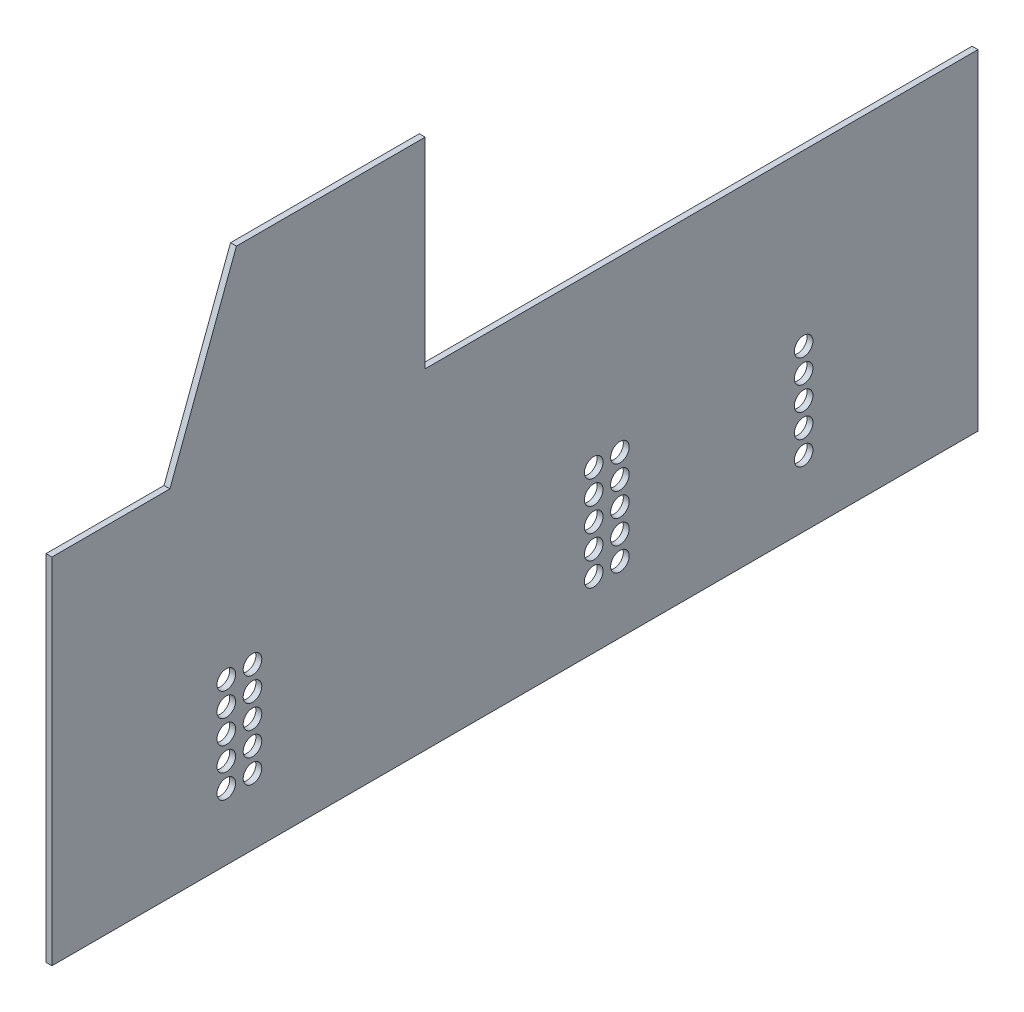
ISO-10303-21;
HEADER;
FILE_DESCRIPTION(('STEP AP214'),'2;1');
FILE_NAME('part.step','',(''),(''),'','','');
FILE_SCHEMA(('AUTOMOTIVE_DESIGN { 1 0 10303 214 1 1 1 1 }'));
ENDSEC;
DATA;
#1=APPLICATION_CONTEXT('core data for automotive mechanical design processes');
#2=APPLICATION_PROTOCOL_DEFINITION('international standard','automotive_design',2000,#1);
#3=PRODUCT_CONTEXT('',#1,'mechanical');
#4=PRODUCT('Part','Part','',(#3));
#5=PRODUCT_RELATED_PRODUCT_CATEGORY('part','',(#4));
#6=PRODUCT_DEFINITION_FORMATION('','',#4);
#7=PRODUCT_DEFINITION_CONTEXT('part definition',#1,'design');
#8=PRODUCT_DEFINITION('design','',#6,#7);
#9=PRODUCT_DEFINITION_SHAPE('','',#8);
#10=(LENGTH_UNIT() NAMED_UNIT(*) SI_UNIT(.MILLI.,.METRE.));
#11=(NAMED_UNIT(*) PLANE_ANGLE_UNIT() SI_UNIT($,.RADIAN.));
#12=(NAMED_UNIT(*) SI_UNIT($,.STERADIAN.) SOLID_ANGLE_UNIT());
#13=UNCERTAINTY_MEASURE_WITH_UNIT(LENGTH_MEASURE(1.E-05),#10,'distance_accuracy_value','');
#14=(GEOMETRIC_REPRESENTATION_CONTEXT(3) GLOBAL_UNCERTAINTY_ASSIGNED_CONTEXT((#13)) GLOBAL_UNIT_ASSIGNED_CONTEXT((#10,
#11,#12)) REPRESENTATION_CONTEXT('',''));
#15=CARTESIAN_POINT('',(0.,0.,0.));
#16=DIRECTION('',(0.,0.,1.));
#17=DIRECTION('',(1.,0.,0.));
#18=AXIS2_PLACEMENT_3D('',#15,#16,#17);
#19=CARTESIAN_POINT('',(1.5875,-40.4748999999981,-155.333699999996));
#20=DIRECTION('',(-1.,0.,0.));
#21=DIRECTION('',(0.,0.,1.));
#22=AXIS2_PLACEMENT_3D('',#19,#20,#21);
#23=CYLINDRICAL_SURFACE('',#22,4.99999999999999);
#24=CARTESIAN_POINT('',(1.5875,-40.4748999999981,-155.333699999996));
#25=DIRECTION('',(-1.,0.,0.));
#26=DIRECTION('',(0.,0.,1.));
#27=AXIS2_PLACEMENT_3D('',#24,#25,#26);
#28=CIRCLE('',#27,4.99999999999999);
#29=CARTESIAN_POINT('',(1.5875,-40.4748999999981,-150.333699999996));
#30=VERTEX_POINT('',#29);
#31=EDGE_CURVE('E42',#30,#30,#28,.T.);
#32=ORIENTED_EDGE('',*,*,#31,.F.);
#33=EDGE_LOOP('',(#32));
#34=FACE_BOUND('',#33,.T.);
#35=CARTESIAN_POINT('',(-1.5875,-40.4748999999981,-155.333699999996));
#36=DIRECTION('',(-1.,0.,0.));
#37=DIRECTION('',(0.,0.,1.));
#38=AXIS2_PLACEMENT_3D('',#35,#36,#37);
#39=CIRCLE('',#38,4.99999999999999);
#40=CARTESIAN_POINT('',(-1.5875,-40.4748999999981,-150.333699999996));
#41=VERTEX_POINT('',#40);
#42=EDGE_CURVE('E11',#41,#41,#39,.T.);
#43=ORIENTED_EDGE('',*,*,#42,.T.);
#44=EDGE_LOOP('',(#43));
#45=FACE_BOUND('',#44,.T.);
#46=ADVANCED_FACE('F35',(#34,#45),#23,.F.);
#47=CARTESIAN_POINT('',(1.5875,-53.1748999999981,-155.333699999996));
#48=DIRECTION('',(-1.,0.,0.));
#49=DIRECTION('',(0.,0.,1.));
#50=AXIS2_PLACEMENT_3D('',#47,#48,#49);
#51=CYLINDRICAL_SURFACE('',#50,4.99999999999999);
#52=CARTESIAN_POINT('',(1.5875,-53.1748999999981,-155.333699999996));
#53=DIRECTION('',(-1.,0.,0.));
#54=DIRECTION('',(0.,0.,1.));
#55=AXIS2_PLACEMENT_3D('',#52,#53,#54);
#56=CIRCLE('',#55,4.99999999999999);
#57=CARTESIAN_POINT('',(1.5875,-53.1748999999981,-150.333699999996));
#58=VERTEX_POINT('',#57);
#59=EDGE_CURVE('E193',#58,#58,#56,.T.);
#60=ORIENTED_EDGE('',*,*,#59,.F.);
#61=EDGE_LOOP('',(#60));
#62=FACE_BOUND('',#61,.T.);
#63=CARTESIAN_POINT('',(-1.5875,-53.1748999999981,-155.333699999996));
#64=DIRECTION('',(-1.,0.,0.));
#65=DIRECTION('',(0.,0.,1.));
#66=AXIS2_PLACEMENT_3D('',#63,#64,#65);
#67=CIRCLE('',#66,4.99999999999999);
#68=CARTESIAN_POINT('',(-1.5875,-53.1748999999981,-150.333699999996));
#69=VERTEX_POINT('',#68);
#70=EDGE_CURVE('E196',#69,#69,#67,.T.);
#71=ORIENTED_EDGE('',*,*,#70,.T.);
#72=EDGE_LOOP('',(#71));
#73=FACE_BOUND('',#72,.T.);
#74=ADVANCED_FACE('F204',(#62,#73),#51,.F.);
#75=CARTESIAN_POINT('',(1.5875,-15.0748999999981,-155.333699999996));
#76=DIRECTION('',(-1.,0.,0.));
#77=DIRECTION('',(0.,0.,1.));
#78=AXIS2_PLACEMENT_3D('',#75,#76,#77);
#79=CYLINDRICAL_SURFACE('',#78,4.99999999999999);
#80=CARTESIAN_POINT('',(1.5875,-15.0748999999981,-155.333699999996));
#81=DIRECTION('',(-1.,0.,0.));
#82=DIRECTION('',(0.,0.,1.));
#83=AXIS2_PLACEMENT_3D('',#80,#81,#82);
#84=CIRCLE('',#83,4.99999999999999);
#85=CARTESIAN_POINT('',(1.5875,-15.0748999999981,-150.333699999996));
#86=VERTEX_POINT('',#85);
#87=EDGE_CURVE('E187',#86,#86,#84,.T.);
#88=ORIENTED_EDGE('',*,*,#87,.F.);
#89=EDGE_LOOP('',(#88));
#90=FACE_BOUND('',#89,.T.);
#91=CARTESIAN_POINT('',(-1.5875,-15.0748999999981,-155.333699999996));
#92=DIRECTION('',(-1.,0.,0.));
#93=DIRECTION('',(0.,0.,1.));
#94=AXIS2_PLACEMENT_3D('',#91,#92,#93);
#95=CIRCLE('',#94,4.99999999999999);
#96=CARTESIAN_POINT('',(-1.5875,-15.0748999999981,-150.333699999996));
#97=VERTEX_POINT('',#96);
#98=EDGE_CURVE('E190',#97,#97,#95,.T.);
#99=ORIENTED_EDGE('',*,*,#98,.T.);
#100=EDGE_LOOP('',(#99));
#101=FACE_BOUND('',#100,.T.);
#102=ADVANCED_FACE('F243',(#90,#101),#79,.F.);
#103=CARTESIAN_POINT('',(1.5875,-27.7748999999981,-155.333699999996));
#104=DIRECTION('',(-1.,0.,0.));
#105=DIRECTION('',(0.,0.,1.));
#106=AXIS2_PLACEMENT_3D('',#103,#104,#105);
#107=CYLINDRICAL_SURFACE('',#106,4.99999999999999);
#108=CARTESIAN_POINT('',(1.5875,-27.7748999999981,-155.333699999996));
#109=DIRECTION('',(-1.,0.,0.));
#110=DIRECTION('',(0.,0.,1.));
#111=AXIS2_PLACEMENT_3D('',#108,#109,#110);
#112=CIRCLE('',#111,4.99999999999999);
#113=CARTESIAN_POINT('',(1.5875,-27.7748999999981,-150.333699999996));
#114=VERTEX_POINT('',#113);
#115=EDGE_CURVE('E181',#114,#114,#112,.T.);
#116=ORIENTED_EDGE('',*,*,#115,.F.);
#117=EDGE_LOOP('',(#116));
#118=FACE_BOUND('',#117,.T.);
#119=CARTESIAN_POINT('',(-1.5875,-27.7748999999981,-155.333699999996));
#120=DIRECTION('',(-1.,0.,0.));
#121=DIRECTION('',(0.,0.,1.));
#122=AXIS2_PLACEMENT_3D('',#119,#120,#121);
#123=CIRCLE('',#122,4.99999999999999);
#124=CARTESIAN_POINT('',(-1.5875,-27.7748999999981,-150.333699999996));
#125=VERTEX_POINT('',#124);
#126=EDGE_CURVE('E184',#125,#125,#123,.T.);
#127=ORIENTED_EDGE('',*,*,#126,.T.);
#128=EDGE_LOOP('',(#127));
#129=FACE_BOUND('',#128,.T.);
#130=ADVANCED_FACE('F239',(#118,#129),#107,.F.);
#131=CARTESIAN_POINT('',(1.5875,-2.37489999999807,-155.333699999996));
#132=DIRECTION('',(-1.,0.,0.));
#133=DIRECTION('',(0.,0.,1.));
#134=AXIS2_PLACEMENT_3D('',#131,#132,#133);
#135=CYLINDRICAL_SURFACE('',#134,4.99999999999999);
#136=CARTESIAN_POINT('',(1.5875,-2.37489999999807,-155.333699999996));
#137=DIRECTION('',(-1.,0.,0.));
#138=DIRECTION('',(0.,0.,1.));
#139=AXIS2_PLACEMENT_3D('',#136,#137,#138);
#140=CIRCLE('',#139,4.99999999999999);
#141=CARTESIAN_POINT('',(1.5875,-2.37489999999807,-150.333699999996));
#142=VERTEX_POINT('',#141);
#143=EDGE_CURVE('E175',#142,#142,#140,.T.);
#144=ORIENTED_EDGE('',*,*,#143,.F.);
#145=EDGE_LOOP('',(#144));
#146=FACE_BOUND('',#145,.T.);
#147=CARTESIAN_POINT('',(-1.5875,-2.37489999999807,-155.333699999996));
#148=DIRECTION('',(-1.,0.,0.));
#149=DIRECTION('',(0.,0.,1.));
#150=AXIS2_PLACEMENT_3D('',#147,#148,#149);
#151=CIRCLE('',#150,4.99999999999999);
#152=CARTESIAN_POINT('',(-1.5875,-2.37489999999807,-150.333699999996));
#153=VERTEX_POINT('',#152);
#154=EDGE_CURVE('E178',#153,#153,#151,.T.);
#155=ORIENTED_EDGE('',*,*,#154,.T.);
#156=EDGE_LOOP('',(#155));
#157=FACE_BOUND('',#156,.T.);
#158=ADVANCED_FACE('F233',(#146,#157),#135,.F.);
#159=CARTESIAN_POINT('',(1.5875,88.9,249.174));
#160=DIRECTION('',(0.,-1.,0.));
#161=DIRECTION('',(0.,0.,-1.));
#162=AXIS2_PLACEMENT_3D('',#159,#160,#161);
#163=PLANE('',#162);
#164=DIRECTION('',(-1.,0.,0.));
#165=VECTOR('',#164,1.);
#166=CARTESIAN_POINT('',(1.5875,88.9,48.2853999999997));
#167=LINE('',#166,#165);
#168=CARTESIAN_POINT('',(1.5875,88.9,48.2853999999997));
#169=VERTEX_POINT('',#168);
#170=CARTESIAN_POINT('',(-1.5875,88.9,48.2853999999997));
#171=VERTEX_POINT('',#170);
#172=EDGE_CURVE('E49',#169,#171,#167,.T.);
#173=ORIENTED_EDGE('',*,*,#172,.F.);
#174=DIRECTION('',(0.,0.,1.));
#175=VECTOR('',#174,1.);
#176=CARTESIAN_POINT('',(1.5875,88.9,249.174));
#177=LINE('',#176,#175);
#178=CARTESIAN_POINT('',(1.5875,88.9,-249.174));
#179=VERTEX_POINT('',#178);
#180=EDGE_CURVE('E78',#179,#169,#177,.T.);
#181=ORIENTED_EDGE('',*,*,#180,.F.);
#182=DIRECTION('',(-1.,0.,0.));
#183=VECTOR('',#182,1.);
#184=CARTESIAN_POINT('',(1.5875,88.9,-249.174));
#185=LINE('',#184,#183);
#186=CARTESIAN_POINT('',(-1.5875,88.9,-249.174));
#187=VERTEX_POINT('',#186);
#188=EDGE_CURVE('E173',#179,#187,#185,.T.);
#189=ORIENTED_EDGE('',*,*,#188,.T.);
#190=DIRECTION('',(0.,0.,1.));
#191=VECTOR('',#190,1.);
#192=CARTESIAN_POINT('',(-1.5875,88.9,249.174));
#193=LINE('',#192,#191);
#194=EDGE_CURVE('E165',#187,#171,#193,.T.);
#195=ORIENTED_EDGE('',*,*,#194,.T.);
#196=EDGE_LOOP('',(#173,#181,#189,#195));
#197=FACE_BOUND('',#196,.T.);
#198=ADVANCED_FACE('F230',(#197),#163,.F.);
#199=CARTESIAN_POINT('',(1.5875,88.9,-249.174));
#200=DIRECTION('',(0.,0.,1.));
#201=DIRECTION('',(0.,-1.,0.));
#202=AXIS2_PLACEMENT_3D('',#199,#200,#201);
#203=PLANE('',#202);
#204=DIRECTION('',(0.,1.,0.));
#205=VECTOR('',#204,1.);
#206=CARTESIAN_POINT('',(-1.5875,88.9,-249.174));
#207=LINE('',#206,#205);
#208=CARTESIAN_POINT('',(-1.5875,-88.9,-249.174));
#209=VERTEX_POINT('',#208);
#210=EDGE_CURVE('E150',#209,#187,#207,.T.);
#211=ORIENTED_EDGE('',*,*,#210,.T.);
#212=ORIENTED_EDGE('',*,*,#188,.F.);
#213=DIRECTION('',(0.,1.,0.));
#214=VECTOR('',#213,1.);
#215=CARTESIAN_POINT('',(1.5875,88.9,-249.174));
#216=LINE('',#215,#214);
#217=CARTESIAN_POINT('',(1.5875,-88.9,-249.174));
#218=VERTEX_POINT('',#217);
#219=EDGE_CURVE('E156',#218,#179,#216,.T.);
#220=ORIENTED_EDGE('',*,*,#219,.F.);
#221=DIRECTION('',(-1.,0.,0.));
#222=VECTOR('',#221,1.);
#223=CARTESIAN_POINT('',(1.5875,-88.9,-249.174));
#224=LINE('',#223,#222);
#225=EDGE_CURVE('E162',#218,#209,#224,.T.);
#226=ORIENTED_EDGE('',*,*,#225,.T.);
#227=EDGE_LOOP('',(#211,#212,#220,#226));
#228=FACE_BOUND('',#227,.T.);
#229=ADVANCED_FACE('F228',(#228),#203,.F.);
#230=CARTESIAN_POINT('',(1.5875,88.9,249.174));
#231=DIRECTION('',(0.,0.,-1.));
#232=DIRECTION('',(-1.,0.,0.));
#233=AXIS2_PLACEMENT_3D('',#230,#231,#232);
#234=PLANE('',#233);
#235=DIRECTION('',(0.,-1.,0.));
#236=VECTOR('',#235,1.);
#237=CARTESIAN_POINT('',(-1.5875,88.9,249.174));
#238=LINE('',#237,#236);
#239=CARTESIAN_POINT('',(-1.5875,101.6,249.174));
#240=VERTEX_POINT('',#239);
#241=CARTESIAN_POINT('',(-1.5875,-88.9,249.174));
#242=VERTEX_POINT('',#241);
#243=EDGE_CURVE('E167',#240,#242,#238,.T.);
#244=ORIENTED_EDGE('',*,*,#243,.T.);
#245=DIRECTION('',(-1.,0.,0.));
#246=VECTOR('',#245,1.);
#247=CARTESIAN_POINT('',(1.5875,-88.9,249.174));
#248=LINE('',#247,#246);
#249=CARTESIAN_POINT('',(1.5875,-88.9,249.174));
#250=VERTEX_POINT('',#249);
#251=EDGE_CURVE('E171',#250,#242,#248,.T.);
#252=ORIENTED_EDGE('',*,*,#251,.F.);
#253=DIRECTION('',(0.,-1.,0.));
#254=VECTOR('',#253,1.);
#255=CARTESIAN_POINT('',(1.5875,88.9,249.174));
#256=LINE('',#255,#254);
#257=CARTESIAN_POINT('',(1.5875,101.6,249.174));
#258=VERTEX_POINT('',#257);
#259=EDGE_CURVE('E159',#258,#250,#256,.T.);
#260=ORIENTED_EDGE('',*,*,#259,.F.);
#261=DIRECTION('',(-1.,0.,0.));
#262=VECTOR('',#261,1.);
#263=CARTESIAN_POINT('',(1.5875,101.6,249.174));
#264=LINE('',#263,#262);
#265=EDGE_CURVE('E151',#258,#240,#264,.T.);
#266=ORIENTED_EDGE('',*,*,#265,.T.);
#267=EDGE_LOOP('',(#244,#252,#260,#266));
#268=FACE_BOUND('',#267,.T.);
#269=ADVANCED_FACE('F225',(#268),#234,.F.);
#270=CARTESIAN_POINT('',(1.5875,-88.9,249.174));
#271=DIRECTION('',(0.,1.,0.));
#272=DIRECTION('',(0.,0.,1.));
#273=AXIS2_PLACEMENT_3D('',#270,#271,#272);
#274=PLANE('',#273);
#275=DIRECTION('',(0.,0.,-1.));
#276=VECTOR('',#275,1.);
#277=CARTESIAN_POINT('',(-1.5875,-88.9,249.174));
#278=LINE('',#277,#276);
#279=EDGE_CURVE('E75',#242,#209,#278,.T.);
#280=ORIENTED_EDGE('',*,*,#279,.T.);
#281=ORIENTED_EDGE('',*,*,#225,.F.);
#282=DIRECTION('',(0.,0.,-1.));
#283=VECTOR('',#282,1.);
#284=CARTESIAN_POINT('',(1.5875,-88.9,249.174));
#285=LINE('',#284,#283);
#286=EDGE_CURVE('E58',#250,#218,#285,.T.);
#287=ORIENTED_EDGE('',*,*,#286,.F.);
#288=ORIENTED_EDGE('',*,*,#251,.T.);
#289=EDGE_LOOP('',(#280,#281,#287,#288));
#290=FACE_BOUND('',#289,.T.);
#291=ADVANCED_FACE('F217',(#290),#274,.F.);
#292=CARTESIAN_POINT('',(1.5875,0.,0.));
#293=DIRECTION('',(1.,0.,0.));
#294=DIRECTION('',(0.,0.,-1.));
#295=AXIS2_PLACEMENT_3D('',#292,#293,#294);
#296=PLANE('',#295);
#297=CARTESIAN_POINT('',(1.5875,-40.4748999999981,-56.4768999999964));
#298=DIRECTION('',(-1.,0.,0.));
#299=DIRECTION('',(0.,0.,1.));
#300=AXIS2_PLACEMENT_3D('',#297,#298,#299);
#301=CIRCLE('',#300,4.99999999999999);
#302=CARTESIAN_POINT('',(1.5875,-40.4748999999981,-51.4768999999965));
#303=VERTEX_POINT('',#302);
#304=EDGE_CURVE('E687',#303,#303,#301,.T.);
#305=ORIENTED_EDGE('',*,*,#304,.T.);
#306=EDGE_LOOP('',(#305));
#307=FACE_BOUND('',#306,.T.);
#308=CARTESIAN_POINT('',(1.5875,-53.1748999999981,-56.4768999999964));
#309=DIRECTION('',(-1.,0.,0.));
#310=DIRECTION('',(0.,0.,1.));
#311=AXIS2_PLACEMENT_3D('',#308,#309,#310);
#312=CIRCLE('',#311,4.99999999999999);
#313=CARTESIAN_POINT('',(1.5875,-53.1748999999981,-51.4768999999965));
#314=VERTEX_POINT('',#313);
#315=EDGE_CURVE('E681',#314,#314,#312,.T.);
#316=ORIENTED_EDGE('',*,*,#315,.T.);
#317=EDGE_LOOP('',(#316));
#318=FACE_BOUND('',#317,.T.);
#319=CARTESIAN_POINT('',(1.5875,-15.0748999999981,-56.4768999999964));
#320=DIRECTION('',(-1.,0.,0.));
#321=DIRECTION('',(0.,0.,1.));
#322=AXIS2_PLACEMENT_3D('',#319,#320,#321);
#323=CIRCLE('',#322,4.99999999999999);
#324=CARTESIAN_POINT('',(1.5875,-15.0748999999981,-51.4768999999965));
#325=VERTEX_POINT('',#324);
#326=EDGE_CURVE('E675',#325,#325,#323,.T.);
#327=ORIENTED_EDGE('',*,*,#326,.T.);
#328=EDGE_LOOP('',(#327));
#329=FACE_BOUND('',#328,.T.);
#330=CARTESIAN_POINT('',(1.5875,-27.7748999999981,-56.4768999999964));
#331=DIRECTION('',(-1.,0.,0.));
#332=DIRECTION('',(0.,0.,1.));
#333=AXIS2_PLACEMENT_3D('',#330,#331,#332);
#334=CIRCLE('',#333,4.99999999999999);
#335=CARTESIAN_POINT('',(1.5875,-27.7748999999981,-51.4768999999965));
#336=VERTEX_POINT('',#335);
#337=EDGE_CURVE('E669',#336,#336,#334,.T.);
#338=ORIENTED_EDGE('',*,*,#337,.T.);
#339=EDGE_LOOP('',(#338));
#340=FACE_BOUND('',#339,.T.);
#341=CARTESIAN_POINT('',(1.5875,-2.37489999999807,-56.4768999999964));
#342=DIRECTION('',(-1.,0.,0.));
#343=DIRECTION('',(0.,0.,1.));
#344=AXIS2_PLACEMENT_3D('',#341,#342,#343);
#345=CIRCLE('',#344,4.99999999999999);
#346=CARTESIAN_POINT('',(1.5875,-2.37489999999807,-51.4768999999965));
#347=VERTEX_POINT('',#346);
#348=EDGE_CURVE('E663',#347,#347,#345,.T.);
#349=ORIENTED_EDGE('',*,*,#348,.T.);
#350=EDGE_LOOP('',(#349));
#351=FACE_BOUND('',#350,.T.);
#352=CARTESIAN_POINT('',(1.5875,-2.37489999999807,141.236700000004));
#353=DIRECTION('',(-1.,0.,0.));
#354=DIRECTION('',(0.,0.,1.));
#355=AXIS2_PLACEMENT_3D('',#352,#353,#354);
#356=CIRCLE('',#355,4.99999999999999);
#357=CARTESIAN_POINT('',(1.5875,-2.37489999999807,146.236700000004));
#358=VERTEX_POINT('',#357);
#359=EDGE_CURVE('E646',#358,#358,#356,.T.);
#360=ORIENTED_EDGE('',*,*,#359,.T.);
#361=EDGE_LOOP('',(#360));
#362=FACE_BOUND('',#361,.T.);
#363=CARTESIAN_POINT('',(1.5875,-40.4748999999981,141.236700000004));
#364=DIRECTION('',(-1.,0.,0.));
#365=DIRECTION('',(0.,0.,1.));
#366=AXIS2_PLACEMENT_3D('',#363,#364,#365);
#367=CIRCLE('',#366,4.99999999999999);
#368=CARTESIAN_POINT('',(1.5875,-40.4748999999981,146.236700000004));
#369=VERTEX_POINT('',#368);
#370=EDGE_CURVE('E647',#369,#369,#367,.T.);
#371=ORIENTED_EDGE('',*,*,#370,.T.);
#372=EDGE_LOOP('',(#371));
#373=FACE_BOUND('',#372,.T.);
#374=CARTESIAN_POINT('',(1.5875,-53.1748999999981,141.236700000004));
#375=DIRECTION('',(-1.,0.,0.));
#376=DIRECTION('',(0.,0.,1.));
#377=AXIS2_PLACEMENT_3D('',#374,#375,#376);
#378=CIRCLE('',#377,4.99999999999999);
#379=CARTESIAN_POINT('',(1.5875,-53.1748999999981,146.236700000004));
#380=VERTEX_POINT('',#379);
#381=EDGE_CURVE('E657',#380,#380,#378,.T.);
#382=ORIENTED_EDGE('',*,*,#381,.T.);
#383=EDGE_LOOP('',(#382));
#384=FACE_BOUND('',#383,.T.);
#385=CARTESIAN_POINT('',(1.5875,-15.0748999999981,141.236700000004));
#386=DIRECTION('',(-1.,0.,0.));
#387=DIRECTION('',(0.,0.,1.));
#388=AXIS2_PLACEMENT_3D('',#385,#386,#387);
#389=CIRCLE('',#388,4.99999999999999);
#390=CARTESIAN_POINT('',(1.5875,-15.0748999999981,146.236700000004));
#391=VERTEX_POINT('',#390);
#392=EDGE_CURVE('E639',#391,#391,#389,.T.);
#393=ORIENTED_EDGE('',*,*,#392,.T.);
#394=EDGE_LOOP('',(#393));
#395=FACE_BOUND('',#394,.T.);
#396=CARTESIAN_POINT('',(1.5875,-27.7748999999981,141.236700000004));
#397=DIRECTION('',(-1.,0.,0.));
#398=DIRECTION('',(0.,0.,1.));
#399=AXIS2_PLACEMENT_3D('',#396,#397,#398);
#400=CIRCLE('',#399,4.99999999999999);
#401=CARTESIAN_POINT('',(1.5875,-27.7748999999981,146.236700000004));
#402=VERTEX_POINT('',#401);
#403=EDGE_CURVE('E628',#402,#402,#400,.T.);
#404=ORIENTED_EDGE('',*,*,#403,.T.);
#405=EDGE_LOOP('',(#404));
#406=FACE_BOUND('',#405,.T.);
#407=CARTESIAN_POINT('',(1.5875,-40.4748999999981,-42.3799000000043));
#408=DIRECTION('',(-1.,0.,0.));
#409=DIRECTION('',(0.,0.,1.));
#410=AXIS2_PLACEMENT_3D('',#407,#408,#409);
#411=CIRCLE('',#410,5.00000000000002);
#412=CARTESIAN_POINT('',(1.5875,-40.4748999999981,-37.3799000000043));
#413=VERTEX_POINT('',#412);
#414=EDGE_CURVE('E604',#413,#413,#411,.T.);
#415=ORIENTED_EDGE('',*,*,#414,.T.);
#416=EDGE_LOOP('',(#415));
#417=FACE_BOUND('',#416,.T.);
#418=CARTESIAN_POINT('',(1.5875,-53.1748999999981,-42.3799000000043));
#419=DIRECTION('',(-1.,0.,0.));
#420=DIRECTION('',(0.,0.,1.));
#421=AXIS2_PLACEMENT_3D('',#418,#419,#420);
#422=CIRCLE('',#421,5.00000000000002);
#423=CARTESIAN_POINT('',(1.5875,-53.1748999999981,-37.3799000000043));
#424=VERTEX_POINT('',#423);
#425=EDGE_CURVE('E617',#424,#424,#422,.T.);
#426=ORIENTED_EDGE('',*,*,#425,.T.);
#427=EDGE_LOOP('',(#426));
#428=FACE_BOUND('',#427,.T.);
#429=CARTESIAN_POINT('',(1.5875,-15.0748999999981,-42.3799000000043));
#430=DIRECTION('',(-1.,0.,0.));
#431=DIRECTION('',(0.,0.,1.));
#432=AXIS2_PLACEMENT_3D('',#429,#430,#431);
#433=CIRCLE('',#432,5.00000000000002);
#434=CARTESIAN_POINT('',(1.5875,-15.0748999999981,-37.3799000000043));
#435=VERTEX_POINT('',#434);
#436=EDGE_CURVE('E610',#435,#435,#433,.T.);
#437=ORIENTED_EDGE('',*,*,#436,.T.);
#438=EDGE_LOOP('',(#437));
#439=FACE_BOUND('',#438,.T.);
#440=CARTESIAN_POINT('',(1.5875,-2.37489999999812,-42.3799000000043));
#441=DIRECTION('',(-1.,0.,0.));
#442=DIRECTION('',(0.,0.,1.));
#443=AXIS2_PLACEMENT_3D('',#440,#441,#442);
#444=CIRCLE('',#443,5.00000000000002);
#445=CARTESIAN_POINT('',(1.5875,-2.37489999999812,-37.3799000000043));
#446=VERTEX_POINT('',#445);
#447=EDGE_CURVE('E611',#446,#446,#444,.T.);
#448=ORIENTED_EDGE('',*,*,#447,.T.);
#449=EDGE_LOOP('',(#448));
#450=FACE_BOUND('',#449,.T.);
#451=CARTESIAN_POINT('',(1.5875,-27.7748999999981,-42.3799000000043));
#452=DIRECTION('',(-1.,0.,0.));
#453=DIRECTION('',(0.,0.,1.));
#454=AXIS2_PLACEMENT_3D('',#451,#452,#453);
#455=CIRCLE('',#454,5.00000000000002);
#456=CARTESIAN_POINT('',(1.5875,-27.7748999999981,-37.3799000000043));
#457=VERTEX_POINT('',#456);
#458=EDGE_CURVE('E600',#457,#457,#455,.T.);
#459=ORIENTED_EDGE('',*,*,#458,.T.);
#460=EDGE_LOOP('',(#459));
#461=FACE_BOUND('',#460,.T.);
#462=CARTESIAN_POINT('',(1.5875,-2.37489999999812,155.333699999996));
#463=DIRECTION('',(-1.,0.,0.));
#464=DIRECTION('',(0.,0.,1.));
#465=AXIS2_PLACEMENT_3D('',#462,#463,#464);
#466=CIRCLE('',#465,5.00000000000002);
#467=CARTESIAN_POINT('',(1.5875,-2.37489999999812,160.333699999996));
#468=VERTEX_POINT('',#467);
#469=EDGE_CURVE('E586',#468,#468,#466,.T.);
#470=ORIENTED_EDGE('',*,*,#469,.T.);
#471=EDGE_LOOP('',(#470));
#472=FACE_BOUND('',#471,.T.);
#473=CARTESIAN_POINT('',(1.5875,-40.4748999999981,155.333699999996));
#474=DIRECTION('',(-1.,0.,0.));
#475=DIRECTION('',(0.,0.,1.));
#476=AXIS2_PLACEMENT_3D('',#473,#474,#475);
#477=CIRCLE('',#476,5.00000000000002);
#478=CARTESIAN_POINT('',(1.5875,-40.4748999999981,160.333699999996));
#479=VERTEX_POINT('',#478);
#480=EDGE_CURVE('E587',#479,#479,#477,.T.);
#481=ORIENTED_EDGE('',*,*,#480,.T.);
#482=EDGE_LOOP('',(#481));
#483=FACE_BOUND('',#482,.T.);
#484=CARTESIAN_POINT('',(1.5875,-53.1748999999981,155.333699999996));
#485=DIRECTION('',(-1.,0.,0.));
#486=DIRECTION('',(0.,0.,1.));
#487=AXIS2_PLACEMENT_3D('',#484,#485,#486);
#488=CIRCLE('',#487,5.00000000000002);
#489=CARTESIAN_POINT('',(1.5875,-53.1748999999981,160.333699999996));
#490=VERTEX_POINT('',#489);
#491=EDGE_CURVE('E597',#490,#490,#488,.T.);
#492=ORIENTED_EDGE('',*,*,#491,.T.);
#493=EDGE_LOOP('',(#492));
#494=FACE_BOUND('',#493,.T.);
#495=CARTESIAN_POINT('',(1.5875,-15.0748999999981,155.333699999996));
#496=DIRECTION('',(-1.,0.,0.));
#497=DIRECTION('',(0.,0.,1.));
#498=AXIS2_PLACEMENT_3D('',#495,#496,#497);
#499=CIRCLE('',#498,5.00000000000002);
#500=CARTESIAN_POINT('',(1.5875,-15.0748999999981,160.333699999996));
#501=VERTEX_POINT('',#500);
#502=EDGE_CURVE('E575',#501,#501,#499,.T.);
#503=ORIENTED_EDGE('',*,*,#502,.T.);
#504=EDGE_LOOP('',(#503));
#505=FACE_BOUND('',#504,.T.);
#506=CARTESIAN_POINT('',(1.5875,-27.7748999999981,155.333699999996));
#507=DIRECTION('',(-1.,0.,0.));
#508=DIRECTION('',(0.,0.,1.));
#509=AXIS2_PLACEMENT_3D('',#506,#507,#508);
#510=CIRCLE('',#509,5.00000000000002);
#511=CARTESIAN_POINT('',(1.5875,-27.7748999999981,160.333699999996));
#512=VERTEX_POINT('',#511);
#513=EDGE_CURVE('E145',#512,#512,#510,.T.);
#514=ORIENTED_EDGE('',*,*,#513,.T.);
#515=EDGE_LOOP('',(#514));
#516=FACE_BOUND('',#515,.T.);
#517=ORIENTED_EDGE('',*,*,#219,.T.);
#518=ORIENTED_EDGE('',*,*,#180,.T.);
#519=DIRECTION('',(0.,1.,0.));
#520=VECTOR('',#519,1.);
#521=CARTESIAN_POINT('',(1.5875,1.68183175719427E-13,48.2853999999999));
#522=LINE('',#521,#520);
#523=CARTESIAN_POINT('',(1.5875,196.85,48.2853999999992));
#524=VERTEX_POINT('',#523);
#525=EDGE_CURVE('E127',#169,#524,#522,.T.);
#526=ORIENTED_EDGE('',*,*,#525,.T.);
#527=DIRECTION('',(0.,0.,-1.));
#528=VECTOR('',#527,1.);
#529=CARTESIAN_POINT('',(1.5875,196.85,0.));
#530=LINE('',#529,#528);
#531=CARTESIAN_POINT('',(1.5875,196.85,149.8854));
#532=VERTEX_POINT('',#531);
#533=EDGE_CURVE('E110',#532,#524,#530,.T.);
#534=ORIENTED_EDGE('',*,*,#533,.F.);
#535=DIRECTION('',(0.,0.936103293489872,-0.351725210807265));
#536=VECTOR('',#535,1.);
#537=CARTESIAN_POINT('',(1.5875,73.7023733748618,196.156068243952));
#538=LINE('',#537,#536);
#539=CARTESIAN_POINT('',(1.5875,101.6,185.674));
#540=VERTEX_POINT('',#539);
#541=EDGE_CURVE('E124',#540,#532,#538,.T.);
#542=ORIENTED_EDGE('',*,*,#541,.F.);
#543=DIRECTION('',(0.,0.,-1.));
#544=VECTOR('',#543,1.);
#545=CARTESIAN_POINT('',(1.5875,101.6,0.));
#546=LINE('',#545,#544);
#547=EDGE_CURVE('E118',#258,#540,#546,.T.);
#548=ORIENTED_EDGE('',*,*,#547,.F.);
#549=ORIENTED_EDGE('',*,*,#259,.T.);
#550=ORIENTED_EDGE('',*,*,#286,.T.);
#551=EDGE_LOOP('',(#517,#518,#526,#534,#542,#548,#549,#550));
#552=FACE_BOUND('',#551,.T.);
#553=ORIENTED_EDGE('',*,*,#143,.T.);
#554=EDGE_LOOP('',(#553));
#555=FACE_BOUND('',#554,.T.);
#556=ORIENTED_EDGE('',*,*,#115,.T.);
#557=EDGE_LOOP('',(#556));
#558=FACE_BOUND('',#557,.T.);
#559=ORIENTED_EDGE('',*,*,#87,.T.);
#560=EDGE_LOOP('',(#559));
#561=FACE_BOUND('',#560,.T.);
#562=ORIENTED_EDGE('',*,*,#59,.T.);
#563=EDGE_LOOP('',(#562));
#564=FACE_BOUND('',#563,.T.);
#565=ORIENTED_EDGE('',*,*,#31,.T.);
#566=EDGE_LOOP('',(#565));
#567=FACE_BOUND('',#566,.T.);
#568=ADVANCED_FACE('F121',(#307,#318,#329,#340,#351,#362,#373,#384,#395,#406,#417,#428,#439,
#450,#461,#472,#483,#494,#505,#516,#552,#555,#558,#561,#564,#567),#296,.T.);
#569=CARTESIAN_POINT('',(-1.5875,0.,0.));
#570=DIRECTION('',(1.,0.,0.));
#571=DIRECTION('',(0.,0.,-1.));
#572=AXIS2_PLACEMENT_3D('',#569,#570,#571);
#573=PLANE('',#572);
#574=CARTESIAN_POINT('',(-1.5875,-40.4748999999981,-56.4768999999964));
#575=DIRECTION('',(-1.,0.,0.));
#576=DIRECTION('',(0.,0.,1.));
#577=AXIS2_PLACEMENT_3D('',#574,#575,#576);
#578=CIRCLE('',#577,4.99999999999999);
#579=CARTESIAN_POINT('',(-1.5875,-40.4748999999981,-51.4768999999965));
#580=VERTEX_POINT('',#579);
#581=EDGE_CURVE('E684',#580,#580,#578,.T.);
#582=ORIENTED_EDGE('',*,*,#581,.F.);
#583=EDGE_LOOP('',(#582));
#584=FACE_BOUND('',#583,.T.);
#585=CARTESIAN_POINT('',(-1.5875,-53.1748999999981,-56.4768999999964));
#586=DIRECTION('',(-1.,0.,0.));
#587=DIRECTION('',(0.,0.,1.));
#588=AXIS2_PLACEMENT_3D('',#585,#586,#587);
#589=CIRCLE('',#588,4.99999999999999);
#590=CARTESIAN_POINT('',(-1.5875,-53.1748999999981,-51.4768999999965));
#591=VERTEX_POINT('',#590);
#592=EDGE_CURVE('E678',#591,#591,#589,.T.);
#593=ORIENTED_EDGE('',*,*,#592,.F.);
#594=EDGE_LOOP('',(#593));
#595=FACE_BOUND('',#594,.T.);
#596=CARTESIAN_POINT('',(-1.5875,-15.0748999999981,-56.4768999999964));
#597=DIRECTION('',(-1.,0.,0.));
#598=DIRECTION('',(0.,0.,1.));
#599=AXIS2_PLACEMENT_3D('',#596,#597,#598);
#600=CIRCLE('',#599,4.99999999999999);
#601=CARTESIAN_POINT('',(-1.5875,-15.0748999999981,-51.4768999999965));
#602=VERTEX_POINT('',#601);
#603=EDGE_CURVE('E672',#602,#602,#600,.T.);
#604=ORIENTED_EDGE('',*,*,#603,.F.);
#605=EDGE_LOOP('',(#604));
#606=FACE_BOUND('',#605,.T.);
#607=CARTESIAN_POINT('',(-1.5875,-27.7748999999981,-56.4768999999964));
#608=DIRECTION('',(-1.,0.,0.));
#609=DIRECTION('',(0.,0.,1.));
#610=AXIS2_PLACEMENT_3D('',#607,#608,#609);
#611=CIRCLE('',#610,4.99999999999999);
#612=CARTESIAN_POINT('',(-1.5875,-27.7748999999981,-51.4768999999965));
#613=VERTEX_POINT('',#612);
#614=EDGE_CURVE('E666',#613,#613,#611,.T.);
#615=ORIENTED_EDGE('',*,*,#614,.F.);
#616=EDGE_LOOP('',(#615));
#617=FACE_BOUND('',#616,.T.);
#618=CARTESIAN_POINT('',(-1.5875,-2.37489999999807,-56.4768999999964));
#619=DIRECTION('',(-1.,0.,0.));
#620=DIRECTION('',(0.,0.,1.));
#621=AXIS2_PLACEMENT_3D('',#618,#619,#620);
#622=CIRCLE('',#621,4.99999999999999);
#623=CARTESIAN_POINT('',(-1.5875,-2.37489999999807,-51.4768999999965));
#624=VERTEX_POINT('',#623);
#625=EDGE_CURVE('E660',#624,#624,#622,.T.);
#626=ORIENTED_EDGE('',*,*,#625,.F.);
#627=EDGE_LOOP('',(#626));
#628=FACE_BOUND('',#627,.T.);
#629=CARTESIAN_POINT('',(-1.5875,-2.37489999999807,141.236700000004));
#630=DIRECTION('',(-1.,0.,0.));
#631=DIRECTION('',(0.,0.,1.));
#632=AXIS2_PLACEMENT_3D('',#629,#630,#631);
#633=CIRCLE('',#632,4.99999999999999);
#634=CARTESIAN_POINT('',(-1.5875,-2.37489999999807,146.236700000004));
#635=VERTEX_POINT('',#634);
#636=EDGE_CURVE('E642',#635,#635,#633,.T.);
#637=ORIENTED_EDGE('',*,*,#636,.F.);
#638=EDGE_LOOP('',(#637));
#639=FACE_BOUND('',#638,.T.);
#640=CARTESIAN_POINT('',(-1.5875,-40.4748999999981,141.236700000004));
#641=DIRECTION('',(-1.,0.,0.));
#642=DIRECTION('',(0.,0.,1.));
#643=AXIS2_PLACEMENT_3D('',#640,#641,#642);
#644=CIRCLE('',#643,4.99999999999999);
#645=CARTESIAN_POINT('',(-1.5875,-40.4748999999981,146.236700000004));
#646=VERTEX_POINT('',#645);
#647=EDGE_CURVE('E643',#646,#646,#644,.T.);
#648=ORIENTED_EDGE('',*,*,#647,.F.);
#649=EDGE_LOOP('',(#648));
#650=FACE_BOUND('',#649,.T.);
#651=CARTESIAN_POINT('',(-1.5875,-53.1748999999981,141.236700000004));
#652=DIRECTION('',(-1.,0.,0.));
#653=DIRECTION('',(0.,0.,1.));
#654=AXIS2_PLACEMENT_3D('',#651,#652,#653);
#655=CIRCLE('',#654,4.99999999999999);
#656=CARTESIAN_POINT('',(-1.5875,-53.1748999999981,146.236700000004));
#657=VERTEX_POINT('',#656);
#658=EDGE_CURVE('E650',#657,#657,#655,.T.);
#659=ORIENTED_EDGE('',*,*,#658,.F.);
#660=EDGE_LOOP('',(#659));
#661=FACE_BOUND('',#660,.T.);
#662=CARTESIAN_POINT('',(-1.5875,-15.0748999999981,141.236700000004));
#663=DIRECTION('',(-1.,0.,0.));
#664=DIRECTION('',(0.,0.,1.));
#665=AXIS2_PLACEMENT_3D('',#662,#663,#664);
#666=CIRCLE('',#665,4.99999999999999);
#667=CARTESIAN_POINT('',(-1.5875,-15.0748999999981,146.236700000004));
#668=VERTEX_POINT('',#667);
#669=EDGE_CURVE('E634',#668,#668,#666,.T.);
#670=ORIENTED_EDGE('',*,*,#669,.F.);
#671=EDGE_LOOP('',(#670));
#672=FACE_BOUND('',#671,.T.);
#673=CARTESIAN_POINT('',(-1.5875,-27.7748999999981,141.236700000004));
#674=DIRECTION('',(-1.,0.,0.));
#675=DIRECTION('',(0.,0.,1.));
#676=AXIS2_PLACEMENT_3D('',#673,#674,#675);
#677=CIRCLE('',#676,4.99999999999999);
#678=CARTESIAN_POINT('',(-1.5875,-27.7748999999981,146.236700000004));
#679=VERTEX_POINT('',#678);
#680=EDGE_CURVE('E631',#679,#679,#677,.T.);
#681=ORIENTED_EDGE('',*,*,#680,.F.);
#682=EDGE_LOOP('',(#681));
#683=FACE_BOUND('',#682,.T.);
#684=CARTESIAN_POINT('',(-1.5875,-40.4748999999981,-42.3799000000043));
#685=DIRECTION('',(-1.,0.,0.));
#686=DIRECTION('',(0.,0.,1.));
#687=AXIS2_PLACEMENT_3D('',#684,#685,#686);
#688=CIRCLE('',#687,5.00000000000002);
#689=CARTESIAN_POINT('',(-1.5875,-40.4748999999981,-37.3799000000043));
#690=VERTEX_POINT('',#689);
#691=EDGE_CURVE('E620',#690,#690,#688,.T.);
#692=ORIENTED_EDGE('',*,*,#691,.F.);
#693=EDGE_LOOP('',(#692));
#694=FACE_BOUND('',#693,.T.);
#695=CARTESIAN_POINT('',(-1.5875,-53.1748999999981,-42.3799000000043));
#696=DIRECTION('',(-1.,0.,0.));
#697=DIRECTION('',(0.,0.,1.));
#698=AXIS2_PLACEMENT_3D('',#695,#696,#697);
#699=CIRCLE('',#698,5.00000000000002);
#700=CARTESIAN_POINT('',(-1.5875,-53.1748999999981,-37.3799000000043));
#701=VERTEX_POINT('',#700);
#702=EDGE_CURVE('E614',#701,#701,#699,.T.);
#703=ORIENTED_EDGE('',*,*,#702,.F.);
#704=EDGE_LOOP('',(#703));
#705=FACE_BOUND('',#704,.T.);
#706=CARTESIAN_POINT('',(-1.5875,-15.0748999999981,-42.3799000000043));
#707=DIRECTION('',(-1.,0.,0.));
#708=DIRECTION('',(0.,0.,1.));
#709=AXIS2_PLACEMENT_3D('',#706,#707,#708);
#710=CIRCLE('',#709,5.00000000000002);
#711=CARTESIAN_POINT('',(-1.5875,-15.0748999999981,-37.3799000000043));
#712=VERTEX_POINT('',#711);
#713=EDGE_CURVE('E607',#712,#712,#710,.T.);
#714=ORIENTED_EDGE('',*,*,#713,.F.);
#715=EDGE_LOOP('',(#714));
#716=FACE_BOUND('',#715,.T.);
#717=CARTESIAN_POINT('',(-1.5875,-2.37489999999812,-42.3799000000043));
#718=DIRECTION('',(-1.,0.,0.));
#719=DIRECTION('',(0.,0.,1.));
#720=AXIS2_PLACEMENT_3D('',#717,#718,#719);
#721=CIRCLE('',#720,5.00000000000002);
#722=CARTESIAN_POINT('',(-1.5875,-2.37489999999812,-37.3799000000043));
#723=VERTEX_POINT('',#722);
#724=EDGE_CURVE('E625',#723,#723,#721,.T.);
#725=ORIENTED_EDGE('',*,*,#724,.F.);
#726=EDGE_LOOP('',(#725));
#727=FACE_BOUND('',#726,.T.);
#728=CARTESIAN_POINT('',(-1.5875,-27.7748999999981,-42.3799000000043));
#729=DIRECTION('',(-1.,0.,0.));
#730=DIRECTION('',(0.,0.,1.));
#731=AXIS2_PLACEMENT_3D('',#728,#729,#730);
#732=CIRCLE('',#731,5.00000000000002);
#733=CARTESIAN_POINT('',(-1.5875,-27.7748999999981,-37.3799000000043));
#734=VERTEX_POINT('',#733);
#735=EDGE_CURVE('E601',#734,#734,#732,.T.);
#736=ORIENTED_EDGE('',*,*,#735,.F.);
#737=EDGE_LOOP('',(#736));
#738=FACE_BOUND('',#737,.T.);
#739=CARTESIAN_POINT('',(-1.5875,-2.37489999999812,155.333699999996));
#740=DIRECTION('',(-1.,0.,0.));
#741=DIRECTION('',(0.,0.,1.));
#742=AXIS2_PLACEMENT_3D('',#739,#740,#741);
#743=CIRCLE('',#742,5.00000000000002);
#744=CARTESIAN_POINT('',(-1.5875,-2.37489999999812,160.333699999996));
#745=VERTEX_POINT('',#744);
#746=EDGE_CURVE('E580',#745,#745,#743,.T.);
#747=ORIENTED_EDGE('',*,*,#746,.F.);
#748=EDGE_LOOP('',(#747));
#749=FACE_BOUND('',#748,.T.);
#750=CARTESIAN_POINT('',(-1.5875,-40.4748999999981,155.333699999996));
#751=DIRECTION('',(-1.,0.,0.));
#752=DIRECTION('',(0.,0.,1.));
#753=AXIS2_PLACEMENT_3D('',#750,#751,#752);
#754=CIRCLE('',#753,5.00000000000002);
#755=CARTESIAN_POINT('',(-1.5875,-40.4748999999981,160.333699999996));
#756=VERTEX_POINT('',#755);
#757=EDGE_CURVE('E583',#756,#756,#754,.T.);
#758=ORIENTED_EDGE('',*,*,#757,.F.);
#759=EDGE_LOOP('',(#758));
#760=FACE_BOUND('',#759,.T.);
#761=CARTESIAN_POINT('',(-1.5875,-53.1748999999981,155.333699999996));
#762=DIRECTION('',(-1.,0.,0.));
#763=DIRECTION('',(0.,0.,1.));
#764=AXIS2_PLACEMENT_3D('',#761,#762,#763);
#765=CIRCLE('',#764,5.00000000000002);
#766=CARTESIAN_POINT('',(-1.5875,-53.1748999999981,160.333699999996));
#767=VERTEX_POINT('',#766);
#768=EDGE_CURVE('E590',#767,#767,#765,.T.);
#769=ORIENTED_EDGE('',*,*,#768,.F.);
#770=EDGE_LOOP('',(#769));
#771=FACE_BOUND('',#770,.T.);
#772=CARTESIAN_POINT('',(-1.5875,-15.0748999999981,155.333699999996));
#773=DIRECTION('',(-1.,0.,0.));
#774=DIRECTION('',(0.,0.,1.));
#775=AXIS2_PLACEMENT_3D('',#772,#773,#774);
#776=CIRCLE('',#775,5.00000000000002);
#777=CARTESIAN_POINT('',(-1.5875,-15.0748999999981,160.333699999996));
#778=VERTEX_POINT('',#777);
#779=EDGE_CURVE('E573',#778,#778,#776,.T.);
#780=ORIENTED_EDGE('',*,*,#779,.F.);
#781=EDGE_LOOP('',(#780));
#782=FACE_BOUND('',#781,.T.);
#783=CARTESIAN_POINT('',(-1.5875,-27.7748999999981,155.333699999996));
#784=DIRECTION('',(-1.,0.,0.));
#785=DIRECTION('',(0.,0.,1.));
#786=AXIS2_PLACEMENT_3D('',#783,#784,#785);
#787=CIRCLE('',#786,5.00000000000002);
#788=CARTESIAN_POINT('',(-1.5875,-27.7748999999981,160.333699999996));
#789=VERTEX_POINT('',#788);
#790=EDGE_CURVE('E138',#789,#789,#787,.T.);
#791=ORIENTED_EDGE('',*,*,#790,.F.);
#792=EDGE_LOOP('',(#791));
#793=FACE_BOUND('',#792,.T.);
#794=ORIENTED_EDGE('',*,*,#210,.F.);
#795=ORIENTED_EDGE('',*,*,#279,.F.);
#796=ORIENTED_EDGE('',*,*,#243,.F.);
#797=DIRECTION('',(0.,0.,-1.));
#798=VECTOR('',#797,1.);
#799=CARTESIAN_POINT('',(-1.5875,101.6,0.));
#800=LINE('',#799,#798);
#801=CARTESIAN_POINT('',(-1.5875,101.6,185.674));
#802=VERTEX_POINT('',#801);
#803=EDGE_CURVE('E132',#240,#802,#800,.T.);
#804=ORIENTED_EDGE('',*,*,#803,.T.);
#805=DIRECTION('',(0.,0.936103293489872,-0.351725210807265));
#806=VECTOR('',#805,1.);
#807=CARTESIAN_POINT('',(-1.5875,73.7023733748618,196.156068243952));
#808=LINE('',#807,#806);
#809=CARTESIAN_POINT('',(-1.5875,196.85,149.8854));
#810=VERTEX_POINT('',#809);
#811=EDGE_CURVE('E143',#802,#810,#808,.T.);
#812=ORIENTED_EDGE('',*,*,#811,.T.);
#813=DIRECTION('',(0.,0.,-1.));
#814=VECTOR('',#813,1.);
#815=CARTESIAN_POINT('',(-1.5875,196.85,0.));
#816=LINE('',#815,#814);
#817=CARTESIAN_POINT('',(-1.5875,196.85,48.2853999999992));
#818=VERTEX_POINT('',#817);
#819=EDGE_CURVE('E112',#810,#818,#816,.T.);
#820=ORIENTED_EDGE('',*,*,#819,.T.);
#821=DIRECTION('',(0.,1.,0.));
#822=VECTOR('',#821,1.);
#823=CARTESIAN_POINT('',(-1.5875,1.68183175719427E-13,48.2853999999999));
#824=LINE('',#823,#822);
#825=EDGE_CURVE('E135',#171,#818,#824,.T.);
#826=ORIENTED_EDGE('',*,*,#825,.F.);
#827=ORIENTED_EDGE('',*,*,#194,.F.);
#828=EDGE_LOOP('',(#794,#795,#796,#804,#812,#820,#826,#827));
#829=FACE_BOUND('',#828,.T.);
#830=ORIENTED_EDGE('',*,*,#154,.F.);
#831=EDGE_LOOP('',(#830));
#832=FACE_BOUND('',#831,.T.);
#833=ORIENTED_EDGE('',*,*,#126,.F.);
#834=EDGE_LOOP('',(#833));
#835=FACE_BOUND('',#834,.T.);
#836=ORIENTED_EDGE('',*,*,#98,.F.);
#837=EDGE_LOOP('',(#836));
#838=FACE_BOUND('',#837,.T.);
#839=ORIENTED_EDGE('',*,*,#70,.F.);
#840=EDGE_LOOP('',(#839));
#841=FACE_BOUND('',#840,.T.);
#842=ORIENTED_EDGE('',*,*,#42,.F.);
#843=EDGE_LOOP('',(#842));
#844=FACE_BOUND('',#843,.T.);
#845=ADVANCED_FACE('F207',(#584,#595,#606,#617,#628,#639,#650,#661,#672,#683,#694,#705,#716,
#727,#738,#749,#760,#771,#782,#793,#829,#832,#835,#838,#841,#844),#573,.F.);
#846=CARTESIAN_POINT('',(1.5875,73.7023733748618,196.156068243952));
#847=DIRECTION('',(0.,0.351725210807265,0.936103293489872));
#848=DIRECTION('',(0.,-0.936103293489872,0.351725210807265));
#849=AXIS2_PLACEMENT_3D('',#846,#847,#848);
#850=PLANE('',#849);
#851=ORIENTED_EDGE('',*,*,#811,.F.);
#852=DIRECTION('',(-1.,0.,0.));
#853=VECTOR('',#852,1.);
#854=CARTESIAN_POINT('',(1.5875,101.6,185.674));
#855=LINE('',#854,#853);
#856=EDGE_CURVE('E131',#540,#802,#855,.T.);
#857=ORIENTED_EDGE('',*,*,#856,.F.);
#858=ORIENTED_EDGE('',*,*,#541,.T.);
#859=DIRECTION('',(-1.,0.,0.));
#860=VECTOR('',#859,1.);
#861=CARTESIAN_POINT('',(1.5875,196.85,149.8854));
#862=LINE('',#861,#860);
#863=EDGE_CURVE('E107',#532,#810,#862,.T.);
#864=ORIENTED_EDGE('',*,*,#863,.T.);
#865=EDGE_LOOP('',(#851,#857,#858,#864));
#866=FACE_BOUND('',#865,.T.);
#867=ADVANCED_FACE('F130',(#866),#850,.T.);
#868=CARTESIAN_POINT('',(1.5875,101.6,0.));
#869=DIRECTION('',(0.,1.,0.));
#870=DIRECTION('',(0.,0.,1.));
#871=AXIS2_PLACEMENT_3D('',#868,#869,#870);
#872=PLANE('',#871);
#873=ORIENTED_EDGE('',*,*,#803,.F.);
#874=ORIENTED_EDGE('',*,*,#265,.F.);
#875=ORIENTED_EDGE('',*,*,#547,.T.);
#876=ORIENTED_EDGE('',*,*,#856,.T.);
#877=EDGE_LOOP('',(#873,#874,#875,#876));
#878=FACE_BOUND('',#877,.T.);
#879=ADVANCED_FACE('F215',(#878),#872,.T.);
#880=CARTESIAN_POINT('',(1.5875,1.68183175719427E-13,48.2853999999999));
#881=DIRECTION('',(0.,0.,1.));
#882=DIRECTION('',(0.,-1.,0.));
#883=AXIS2_PLACEMENT_3D('',#880,#881,#882);
#884=PLANE('',#883);
#885=ORIENTED_EDGE('',*,*,#825,.T.);
#886=DIRECTION('',(-1.,0.,0.));
#887=VECTOR('',#886,1.);
#888=CARTESIAN_POINT('',(1.5875,196.85,48.2853999999992));
#889=LINE('',#888,#887);
#890=EDGE_CURVE('E117',#524,#818,#889,.T.);
#891=ORIENTED_EDGE('',*,*,#890,.F.);
#892=ORIENTED_EDGE('',*,*,#525,.F.);
#893=ORIENTED_EDGE('',*,*,#172,.T.);
#894=EDGE_LOOP('',(#885,#891,#892,#893));
#895=FACE_BOUND('',#894,.T.);
#896=ADVANCED_FACE('F417',(#895),#884,.F.);
#897=CARTESIAN_POINT('',(1.5875,196.85,0.));
#898=DIRECTION('',(0.,1.,0.));
#899=DIRECTION('',(0.,0.,1.));
#900=AXIS2_PLACEMENT_3D('',#897,#898,#899);
#901=PLANE('',#900);
#902=ORIENTED_EDGE('',*,*,#819,.F.);
#903=ORIENTED_EDGE('',*,*,#863,.F.);
#904=ORIENTED_EDGE('',*,*,#533,.T.);
#905=ORIENTED_EDGE('',*,*,#890,.T.);
#906=EDGE_LOOP('',(#902,#903,#904,#905));
#907=FACE_BOUND('',#906,.T.);
#908=ADVANCED_FACE('F109',(#907),#901,.T.);
#909=CARTESIAN_POINT('',(1.5875,-27.7748999999981,155.333699999996));
#910=DIRECTION('',(-1.,0.,0.));
#911=DIRECTION('',(0.,0.,1.));
#912=AXIS2_PLACEMENT_3D('',#909,#910,#911);
#913=CYLINDRICAL_SURFACE('',#912,5.00000000000002);
#914=ORIENTED_EDGE('',*,*,#513,.F.);
#915=EDGE_LOOP('',(#914));
#916=FACE_BOUND('',#915,.T.);
#917=ORIENTED_EDGE('',*,*,#790,.T.);
#918=EDGE_LOOP('',(#917));
#919=FACE_BOUND('',#918,.T.);
#920=ADVANCED_FACE('F410',(#916,#919),#913,.F.);
#921=CARTESIAN_POINT('',(1.5875,-15.0748999999981,155.333699999996));
#922=DIRECTION('',(-1.,0.,0.));
#923=DIRECTION('',(0.,0.,1.));
#924=AXIS2_PLACEMENT_3D('',#921,#922,#923);
#925=CYLINDRICAL_SURFACE('',#924,5.00000000000002);
#926=ORIENTED_EDGE('',*,*,#502,.F.);
#927=EDGE_LOOP('',(#926));
#928=FACE_BOUND('',#927,.T.);
#929=ORIENTED_EDGE('',*,*,#779,.T.);
#930=EDGE_LOOP('',(#929));
#931=FACE_BOUND('',#930,.T.);
#932=ADVANCED_FACE('F400',(#928,#931),#925,.F.);
#933=CARTESIAN_POINT('',(1.5875,-53.1748999999981,155.333699999996));
#934=DIRECTION('',(-1.,0.,0.));
#935=DIRECTION('',(0.,0.,1.));
#936=AXIS2_PLACEMENT_3D('',#933,#934,#935);
#937=CYLINDRICAL_SURFACE('',#936,5.00000000000002);
#938=ORIENTED_EDGE('',*,*,#491,.F.);
#939=EDGE_LOOP('',(#938));
#940=FACE_BOUND('',#939,.T.);
#941=ORIENTED_EDGE('',*,*,#768,.T.);
#942=EDGE_LOOP('',(#941));
#943=FACE_BOUND('',#942,.T.);
#944=ADVANCED_FACE('F396',(#940,#943),#937,.F.);
#945=CARTESIAN_POINT('',(1.5875,-40.4748999999981,155.333699999996));
#946=DIRECTION('',(-1.,0.,0.));
#947=DIRECTION('',(0.,0.,1.));
#948=AXIS2_PLACEMENT_3D('',#945,#946,#947);
#949=CYLINDRICAL_SURFACE('',#948,5.00000000000002);
#950=ORIENTED_EDGE('',*,*,#480,.F.);
#951=EDGE_LOOP('',(#950));
#952=FACE_BOUND('',#951,.T.);
#953=ORIENTED_EDGE('',*,*,#757,.T.);
#954=EDGE_LOOP('',(#953));
#955=FACE_BOUND('',#954,.T.);
#956=ADVANCED_FACE('F399',(#952,#955),#949,.F.);
#957=CARTESIAN_POINT('',(1.5875,-2.37489999999812,155.333699999996));
#958=DIRECTION('',(-1.,0.,0.));
#959=DIRECTION('',(0.,0.,1.));
#960=AXIS2_PLACEMENT_3D('',#957,#958,#959);
#961=CYLINDRICAL_SURFACE('',#960,5.00000000000002);
#962=ORIENTED_EDGE('',*,*,#469,.F.);
#963=EDGE_LOOP('',(#962));
#964=FACE_BOUND('',#963,.T.);
#965=ORIENTED_EDGE('',*,*,#746,.T.);
#966=EDGE_LOOP('',(#965));
#967=FACE_BOUND('',#966,.T.);
#968=ADVANCED_FACE('F394',(#964,#967),#961,.F.);
#969=CARTESIAN_POINT('',(1.5875,-27.7748999999981,-42.3799000000043));
#970=DIRECTION('',(-1.,0.,0.));
#971=DIRECTION('',(0.,0.,1.));
#972=AXIS2_PLACEMENT_3D('',#969,#970,#971);
#973=CYLINDRICAL_SURFACE('',#972,5.00000000000002);
#974=ORIENTED_EDGE('',*,*,#458,.F.);
#975=EDGE_LOOP('',(#974));
#976=FACE_BOUND('',#975,.T.);
#977=ORIENTED_EDGE('',*,*,#735,.T.);
#978=EDGE_LOOP('',(#977));
#979=FACE_BOUND('',#978,.T.);
#980=ADVANCED_FACE('F380',(#976,#979),#973,.F.);
#981=CARTESIAN_POINT('',(1.5875,-2.37489999999812,-42.3799000000043));
#982=DIRECTION('',(-1.,0.,0.));
#983=DIRECTION('',(0.,0.,1.));
#984=AXIS2_PLACEMENT_3D('',#981,#982,#983);
#985=CYLINDRICAL_SURFACE('',#984,5.00000000000002);
#986=ORIENTED_EDGE('',*,*,#447,.F.);
#987=EDGE_LOOP('',(#986));
#988=FACE_BOUND('',#987,.T.);
#989=ORIENTED_EDGE('',*,*,#724,.T.);
#990=EDGE_LOOP('',(#989));
#991=FACE_BOUND('',#990,.T.);
#992=ADVANCED_FACE('F376',(#988,#991),#985,.F.);
#993=CARTESIAN_POINT('',(1.5875,-15.0748999999981,-42.3799000000043));
#994=DIRECTION('',(-1.,0.,0.));
#995=DIRECTION('',(0.,0.,1.));
#996=AXIS2_PLACEMENT_3D('',#993,#994,#995);
#997=CYLINDRICAL_SURFACE('',#996,5.00000000000002);
#998=ORIENTED_EDGE('',*,*,#436,.F.);
#999=EDGE_LOOP('',(#998));
#1000=FACE_BOUND('',#999,.T.);
#1001=ORIENTED_EDGE('',*,*,#713,.T.);
#1002=EDGE_LOOP('',(#1001));
#1003=FACE_BOUND('',#1002,.T.);
#1004=ADVANCED_FACE('F379',(#1000,#1003),#997,.F.);
#1005=CARTESIAN_POINT('',(1.5875,-53.1748999999981,-42.3799000000043));
#1006=DIRECTION('',(-1.,0.,0.));
#1007=DIRECTION('',(0.,0.,1.));
#1008=AXIS2_PLACEMENT_3D('',#1005,#1006,#1007);
#1009=CYLINDRICAL_SURFACE('',#1008,5.00000000000002);
#1010=ORIENTED_EDGE('',*,*,#425,.F.);
#1011=EDGE_LOOP('',(#1010));
#1012=FACE_BOUND('',#1011,.T.);
#1013=ORIENTED_EDGE('',*,*,#702,.T.);
#1014=EDGE_LOOP('',(#1013));
#1015=FACE_BOUND('',#1014,.T.);
#1016=ADVANCED_FACE('F384',(#1012,#1015),#1009,.F.);
#1017=CARTESIAN_POINT('',(1.5875,-40.4748999999981,-42.3799000000043));
#1018=DIRECTION('',(-1.,0.,0.));
#1019=DIRECTION('',(0.,0.,1.));
#1020=AXIS2_PLACEMENT_3D('',#1017,#1018,#1019);
#1021=CYLINDRICAL_SURFACE('',#1020,5.00000000000002);
#1022=ORIENTED_EDGE('',*,*,#414,.F.);
#1023=EDGE_LOOP('',(#1022));
#1024=FACE_BOUND('',#1023,.T.);
#1025=ORIENTED_EDGE('',*,*,#691,.T.);
#1026=EDGE_LOOP('',(#1025));
#1027=FACE_BOUND('',#1026,.T.);
#1028=ADVANCED_FACE('F374',(#1024,#1027),#1021,.F.);
#1029=CARTESIAN_POINT('',(1.5875,-27.7748999999981,141.236700000004));
#1030=DIRECTION('',(-1.,0.,0.));
#1031=DIRECTION('',(0.,0.,1.));
#1032=AXIS2_PLACEMENT_3D('',#1029,#1030,#1031);
#1033=CYLINDRICAL_SURFACE('',#1032,4.99999999999999);
#1034=ORIENTED_EDGE('',*,*,#403,.F.);
#1035=EDGE_LOOP('',(#1034));
#1036=FACE_BOUND('',#1035,.T.);
#1037=ORIENTED_EDGE('',*,*,#680,.T.);
#1038=EDGE_LOOP('',(#1037));
#1039=FACE_BOUND('',#1038,.T.);
#1040=ADVANCED_FACE('F370',(#1036,#1039),#1033,.F.);
#1041=CARTESIAN_POINT('',(1.5875,-15.0748999999981,141.236700000004));
#1042=DIRECTION('',(-1.,0.,0.));
#1043=DIRECTION('',(0.,0.,1.));
#1044=AXIS2_PLACEMENT_3D('',#1041,#1042,#1043);
#1045=CYLINDRICAL_SURFACE('',#1044,4.99999999999999);
#1046=ORIENTED_EDGE('',*,*,#392,.F.);
#1047=EDGE_LOOP('',(#1046));
#1048=FACE_BOUND('',#1047,.T.);
#1049=ORIENTED_EDGE('',*,*,#669,.T.);
#1050=EDGE_LOOP('',(#1049));
#1051=FACE_BOUND('',#1050,.T.);
#1052=ADVANCED_FACE('F361',(#1048,#1051),#1045,.F.);
#1053=CARTESIAN_POINT('',(1.5875,-53.1748999999981,141.236700000004));
#1054=DIRECTION('',(-1.,0.,0.));
#1055=DIRECTION('',(0.,0.,1.));
#1056=AXIS2_PLACEMENT_3D('',#1053,#1054,#1055);
#1057=CYLINDRICAL_SURFACE('',#1056,4.99999999999999);
#1058=ORIENTED_EDGE('',*,*,#381,.F.);
#1059=EDGE_LOOP('',(#1058));
#1060=FACE_BOUND('',#1059,.T.);
#1061=ORIENTED_EDGE('',*,*,#658,.T.);
#1062=EDGE_LOOP('',(#1061));
#1063=FACE_BOUND('',#1062,.T.);
#1064=ADVANCED_FACE('F357',(#1060,#1063),#1057,.F.);
#1065=CARTESIAN_POINT('',(1.5875,-40.4748999999981,141.236700000004));
#1066=DIRECTION('',(-1.,0.,0.));
#1067=DIRECTION('',(0.,0.,1.));
#1068=AXIS2_PLACEMENT_3D('',#1065,#1066,#1067);
#1069=CYLINDRICAL_SURFACE('',#1068,4.99999999999999);
#1070=ORIENTED_EDGE('',*,*,#370,.F.);
#1071=EDGE_LOOP('',(#1070));
#1072=FACE_BOUND('',#1071,.T.);
#1073=ORIENTED_EDGE('',*,*,#647,.T.);
#1074=EDGE_LOOP('',(#1073));
#1075=FACE_BOUND('',#1074,.T.);
#1076=ADVANCED_FACE('F360',(#1072,#1075),#1069,.F.);
#1077=CARTESIAN_POINT('',(1.5875,-2.37489999999807,141.236700000004));
#1078=DIRECTION('',(-1.,0.,0.));
#1079=DIRECTION('',(0.,0.,1.));
#1080=AXIS2_PLACEMENT_3D('',#1077,#1078,#1079);
#1081=CYLINDRICAL_SURFACE('',#1080,4.99999999999999);
#1082=ORIENTED_EDGE('',*,*,#359,.F.);
#1083=EDGE_LOOP('',(#1082));
#1084=FACE_BOUND('',#1083,.T.);
#1085=ORIENTED_EDGE('',*,*,#636,.T.);
#1086=EDGE_LOOP('',(#1085));
#1087=FACE_BOUND('',#1086,.T.);
#1088=ADVANCED_FACE('F309',(#1084,#1087),#1081,.F.);
#1089=CARTESIAN_POINT('',(1.5875,-2.37489999999807,-56.4768999999964));
#1090=DIRECTION('',(-1.,0.,0.));
#1091=DIRECTION('',(0.,0.,1.));
#1092=AXIS2_PLACEMENT_3D('',#1089,#1090,#1091);
#1093=CYLINDRICAL_SURFACE('',#1092,4.99999999999999);
#1094=ORIENTED_EDGE('',*,*,#348,.F.);
#1095=EDGE_LOOP('',(#1094));
#1096=FACE_BOUND('',#1095,.T.);
#1097=ORIENTED_EDGE('',*,*,#625,.T.);
#1098=EDGE_LOOP('',(#1097));
#1099=FACE_BOUND('',#1098,.T.);
#1100=ADVANCED_FACE('F303',(#1096,#1099),#1093,.F.);
#1101=CARTESIAN_POINT('',(1.5875,-27.7748999999981,-56.4768999999964));
#1102=DIRECTION('',(-1.,0.,0.));
#1103=DIRECTION('',(0.,0.,1.));
#1104=AXIS2_PLACEMENT_3D('',#1101,#1102,#1103);
#1105=CYLINDRICAL_SURFACE('',#1104,4.99999999999999);
#1106=ORIENTED_EDGE('',*,*,#337,.F.);
#1107=EDGE_LOOP('',(#1106));
#1108=FACE_BOUND('',#1107,.T.);
#1109=ORIENTED_EDGE('',*,*,#614,.T.);
#1110=EDGE_LOOP('',(#1109));
#1111=FACE_BOUND('',#1110,.T.);
#1112=ADVANCED_FACE('F308',(#1108,#1111),#1105,.F.);
#1113=CARTESIAN_POINT('',(1.5875,-15.0748999999981,-56.4768999999964));
#1114=DIRECTION('',(-1.,0.,0.));
#1115=DIRECTION('',(0.,0.,1.));
#1116=AXIS2_PLACEMENT_3D('',#1113,#1114,#1115);
#1117=CYLINDRICAL_SURFACE('',#1116,4.99999999999999);
#1118=ORIENTED_EDGE('',*,*,#326,.F.);
#1119=EDGE_LOOP('',(#1118));
#1120=FACE_BOUND('',#1119,.T.);
#1121=ORIENTED_EDGE('',*,*,#603,.T.);
#1122=EDGE_LOOP('',(#1121));
#1123=FACE_BOUND('',#1122,.T.);
#1124=ADVANCED_FACE('F320',(#1120,#1123),#1117,.F.);
#1125=CARTESIAN_POINT('',(1.5875,-53.1748999999981,-56.4768999999964));
#1126=DIRECTION('',(-1.,0.,0.));
#1127=DIRECTION('',(0.,0.,1.));
#1128=AXIS2_PLACEMENT_3D('',#1125,#1126,#1127);
#1129=CYLINDRICAL_SURFACE('',#1128,4.99999999999999);
#1130=ORIENTED_EDGE('',*,*,#315,.F.);
#1131=EDGE_LOOP('',(#1130));
#1132=FACE_BOUND('',#1131,.T.);
#1133=ORIENTED_EDGE('',*,*,#592,.T.);
#1134=EDGE_LOOP('',(#1133));
#1135=FACE_BOUND('',#1134,.T.);
#1136=ADVANCED_FACE('F330',(#1132,#1135),#1129,.F.);
#1137=CARTESIAN_POINT('',(1.5875,-40.4748999999981,-56.4768999999964));
#1138=DIRECTION('',(-1.,0.,0.));
#1139=DIRECTION('',(0.,0.,1.));
#1140=AXIS2_PLACEMENT_3D('',#1137,#1138,#1139);
#1141=CYLINDRICAL_SURFACE('',#1140,4.99999999999999);
#1142=ORIENTED_EDGE('',*,*,#304,.F.);
#1143=EDGE_LOOP('',(#1142));
#1144=FACE_BOUND('',#1143,.T.);
#1145=ORIENTED_EDGE('',*,*,#581,.T.);
#1146=EDGE_LOOP('',(#1145));
#1147=FACE_BOUND('',#1146,.T.);
#1148=ADVANCED_FACE('F340',(#1144,#1147),#1141,.F.);
#1149=CLOSED_SHELL('',(#46,#74,#102,#130,#158,#198,#229,#269,#291,#568,#845,#867,#879,#896,#908,
#920,#932,#944,#956,#968,#980,#992,#1004,#1016,#1028,#1040,#1052,#1064,#1076,#1088,#1100,#1112,
#1124,#1136,#1148));
#1150=MANIFOLD_SOLID_BREP('B2',#1149);
#1151=ADVANCED_BREP_SHAPE_REPRESENTATION('',(#18,#1150),#14);
#1152=SHAPE_DEFINITION_REPRESENTATION(#9,#1151);
ENDSEC;
END-ISO-10303-21;
